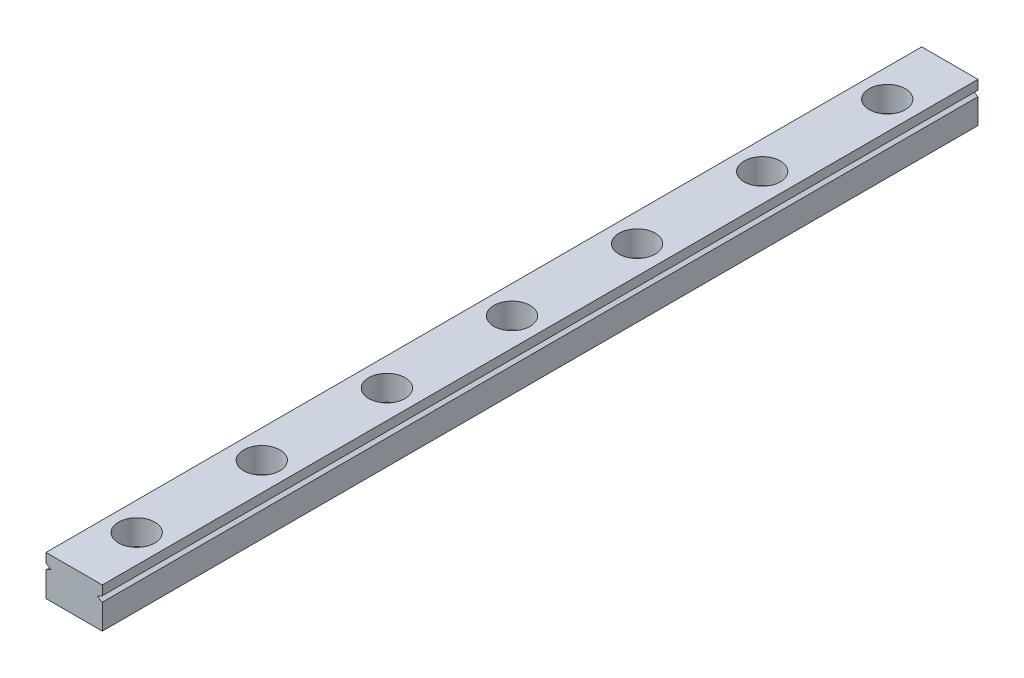
ISO-10303-21;
HEADER;
FILE_DESCRIPTION(('STEP AP214'),'2;1');
FILE_NAME('part.step','',(''),(''),'','','');
FILE_SCHEMA(('AUTOMOTIVE_DESIGN { 1 0 10303 214 1 1 1 1 }'));
ENDSEC;
DATA;
#1=APPLICATION_CONTEXT('core data for automotive mechanical design processes');
#2=APPLICATION_PROTOCOL_DEFINITION('international standard','automotive_design',2000,#1);
#3=PRODUCT_CONTEXT('',#1,'mechanical');
#4=PRODUCT('Part','Part','',(#3));
#5=PRODUCT_RELATED_PRODUCT_CATEGORY('part','',(#4));
#6=PRODUCT_DEFINITION_FORMATION('','',#4);
#7=PRODUCT_DEFINITION_CONTEXT('part definition',#1,'design');
#8=PRODUCT_DEFINITION('design','',#6,#7);
#9=PRODUCT_DEFINITION_SHAPE('','',#8);
#10=(LENGTH_UNIT() NAMED_UNIT(*) SI_UNIT(.MILLI.,.METRE.));
#11=(NAMED_UNIT(*) PLANE_ANGLE_UNIT() SI_UNIT($,.RADIAN.));
#12=(NAMED_UNIT(*) SI_UNIT($,.STERADIAN.) SOLID_ANGLE_UNIT());
#13=UNCERTAINTY_MEASURE_WITH_UNIT(LENGTH_MEASURE(1.E-05),#10,'distance_accuracy_value','');
#14=(GEOMETRIC_REPRESENTATION_CONTEXT(3) GLOBAL_UNCERTAINTY_ASSIGNED_CONTEXT((#13)) GLOBAL_UNIT_ASSIGNED_CONTEXT((#10,
#11,#12)) REPRESENTATION_CONTEXT('',''));
#15=CARTESIAN_POINT('',(0.,0.,0.));
#16=DIRECTION('',(0.,0.,1.));
#17=DIRECTION('',(1.,0.,0.));
#18=AXIS2_PLACEMENT_3D('',#15,#16,#17);
#19=CARTESIAN_POINT('',(0.,4.,140.));
#20=DIRECTION('',(1.,0.,0.));
#21=DIRECTION('',(0.,0.,-1.));
#22=AXIS2_PLACEMENT_3D('',#19,#20,#21);
#23=PLANE('',#22);
#24=DIRECTION('',(0.,-1.,0.));
#25=VECTOR('',#24,1.);
#26=CARTESIAN_POINT('',(0.,4.,0.));
#27=LINE('',#26,#25);
#28=CARTESIAN_POINT('',(0.,4.,0.));
#29=VERTEX_POINT('',#28);
#30=CARTESIAN_POINT('',(0.,0.,0.));
#31=VERTEX_POINT('',#30);
#32=EDGE_CURVE('E141',#29,#31,#27,.T.);
#33=ORIENTED_EDGE('',*,*,#32,.T.);
#34=DIRECTION('',(0.,0.,-1.));
#35=VECTOR('',#34,1.);
#36=CARTESIAN_POINT('',(0.,0.,140.));
#37=LINE('',#36,#35);
#38=CARTESIAN_POINT('',(0.,0.,140.));
#39=VERTEX_POINT('',#38);
#40=EDGE_CURVE('E11',#39,#31,#37,.T.);
#41=ORIENTED_EDGE('',*,*,#40,.F.);
#42=DIRECTION('',(0.,-1.,0.));
#43=VECTOR('',#42,1.);
#44=CARTESIAN_POINT('',(0.,4.,140.));
#45=LINE('',#44,#43);
#46=CARTESIAN_POINT('',(0.,4.,140.));
#47=VERTEX_POINT('',#46);
#48=EDGE_CURVE('E160',#47,#39,#45,.T.);
#49=ORIENTED_EDGE('',*,*,#48,.F.);
#50=DIRECTION('',(0.,0.,-1.));
#51=VECTOR('',#50,1.);
#52=CARTESIAN_POINT('',(0.,4.,140.));
#53=LINE('',#52,#51);
#54=EDGE_CURVE('E137',#47,#29,#53,.T.);
#55=ORIENTED_EDGE('',*,*,#54,.T.);
#56=EDGE_LOOP('',(#33,#41,#49,#55));
#57=FACE_BOUND('',#56,.T.);
#58=ADVANCED_FACE('F33',(#57),#23,.F.);
#59=CARTESIAN_POINT('',(0.,0.,140.));
#60=DIRECTION('',(0.,1.,0.));
#61=DIRECTION('',(0.,0.,1.));
#62=AXIS2_PLACEMENT_3D('',#59,#60,#61);
#63=PLANE('',#62);
#64=CARTESIAN_POINT('',(4.5,0.,130.));
#65=DIRECTION('',(0.,1.,0.));
#66=DIRECTION('',(0.,0.,1.));
#67=AXIS2_PLACEMENT_3D('',#64,#65,#66);
#68=CIRCLE('',#67,1.7);
#69=CARTESIAN_POINT('',(4.5,0.,131.7));
#70=VERTEX_POINT('',#69);
#71=EDGE_CURVE('E211',#70,#70,#68,.T.);
#72=ORIENTED_EDGE('',*,*,#71,.T.);
#73=EDGE_LOOP('',(#72));
#74=FACE_BOUND('',#73,.T.);
#75=CARTESIAN_POINT('',(4.49999999999993,0.,110.));
#76=DIRECTION('',(0.,1.,0.));
#77=DIRECTION('',(0.,0.,1.));
#78=AXIS2_PLACEMENT_3D('',#75,#76,#77);
#79=CIRCLE('',#78,1.7);
#80=CARTESIAN_POINT('',(4.49999999999993,0.,111.7));
#81=VERTEX_POINT('',#80);
#82=EDGE_CURVE('E282',#81,#81,#79,.T.);
#83=ORIENTED_EDGE('',*,*,#82,.T.);
#84=EDGE_LOOP('',(#83));
#85=FACE_BOUND('',#84,.T.);
#86=CARTESIAN_POINT('',(4.49999999999986,0.,90.));
#87=DIRECTION('',(0.,1.,0.));
#88=DIRECTION('',(0.,0.,1.));
#89=AXIS2_PLACEMENT_3D('',#86,#87,#88);
#90=CIRCLE('',#89,1.7);
#91=CARTESIAN_POINT('',(4.49999999999986,0.,91.7));
#92=VERTEX_POINT('',#91);
#93=EDGE_CURVE('E276',#92,#92,#90,.T.);
#94=ORIENTED_EDGE('',*,*,#93,.T.);
#95=EDGE_LOOP('',(#94));
#96=FACE_BOUND('',#95,.T.);
#97=CARTESIAN_POINT('',(4.49999999999979,0.,70.));
#98=DIRECTION('',(0.,1.,0.));
#99=DIRECTION('',(0.,0.,1.));
#100=AXIS2_PLACEMENT_3D('',#97,#98,#99);
#101=CIRCLE('',#100,1.7);
#102=CARTESIAN_POINT('',(4.49999999999979,0.,71.7));
#103=VERTEX_POINT('',#102);
#104=EDGE_CURVE('E270',#103,#103,#101,.T.);
#105=ORIENTED_EDGE('',*,*,#104,.T.);
#106=EDGE_LOOP('',(#105));
#107=FACE_BOUND('',#106,.T.);
#108=CARTESIAN_POINT('',(4.49999999999972,0.,50.));
#109=DIRECTION('',(0.,1.,0.));
#110=DIRECTION('',(0.,0.,1.));
#111=AXIS2_PLACEMENT_3D('',#108,#109,#110);
#112=CIRCLE('',#111,1.7);
#113=CARTESIAN_POINT('',(4.49999999999972,0.,51.7));
#114=VERTEX_POINT('',#113);
#115=EDGE_CURVE('E264',#114,#114,#112,.T.);
#116=ORIENTED_EDGE('',*,*,#115,.T.);
#117=EDGE_LOOP('',(#116));
#118=FACE_BOUND('',#117,.T.);
#119=CARTESIAN_POINT('',(4.49999999999965,0.,30.));
#120=DIRECTION('',(0.,1.,0.));
#121=DIRECTION('',(0.,0.,1.));
#122=AXIS2_PLACEMENT_3D('',#119,#120,#121);
#123=CIRCLE('',#122,1.7);
#124=CARTESIAN_POINT('',(4.49999999999965,0.,31.7));
#125=VERTEX_POINT('',#124);
#126=EDGE_CURVE('E258',#125,#125,#123,.T.);
#127=ORIENTED_EDGE('',*,*,#126,.T.);
#128=EDGE_LOOP('',(#127));
#129=FACE_BOUND('',#128,.T.);
#130=CARTESIAN_POINT('',(4.49999999999958,0.,10.));
#131=DIRECTION('',(0.,1.,0.));
#132=DIRECTION('',(0.,0.,1.));
#133=AXIS2_PLACEMENT_3D('',#130,#131,#132);
#134=CIRCLE('',#133,1.7);
#135=CARTESIAN_POINT('',(4.49999999999958,0.,11.7));
#136=VERTEX_POINT('',#135);
#137=EDGE_CURVE('E252',#136,#136,#134,.T.);
#138=ORIENTED_EDGE('',*,*,#137,.T.);
#139=EDGE_LOOP('',(#138));
#140=FACE_BOUND('',#139,.T.);
#141=DIRECTION('',(1.,0.,0.));
#142=VECTOR('',#141,1.);
#143=CARTESIAN_POINT('',(0.,0.,0.));
#144=LINE('',#143,#142);
#145=CARTESIAN_POINT('',(9.,0.,0.));
#146=VERTEX_POINT('',#145);
#147=EDGE_CURVE('E144',#31,#146,#144,.T.);
#148=ORIENTED_EDGE('',*,*,#147,.T.);
#149=DIRECTION('',(0.,0.,-1.));
#150=VECTOR('',#149,1.);
#151=CARTESIAN_POINT('',(9.,0.,140.));
#152=LINE('',#151,#150);
#153=CARTESIAN_POINT('',(9.,0.,140.));
#154=VERTEX_POINT('',#153);
#155=EDGE_CURVE('E41',#154,#146,#152,.T.);
#156=ORIENTED_EDGE('',*,*,#155,.F.);
#157=DIRECTION('',(1.,0.,0.));
#158=VECTOR('',#157,1.);
#159=CARTESIAN_POINT('',(0.,0.,140.));
#160=LINE('',#159,#158);
#161=EDGE_CURVE('E98',#39,#154,#160,.T.);
#162=ORIENTED_EDGE('',*,*,#161,.F.);
#163=ORIENTED_EDGE('',*,*,#40,.T.);
#164=EDGE_LOOP('',(#148,#156,#162,#163));
#165=FACE_BOUND('',#164,.T.);
#166=ADVANCED_FACE('F291',(#74,#85,#96,#107,#118,#129,#140,#165),#63,.F.);
#167=CARTESIAN_POINT('',(9.,4.,140.));
#168=DIRECTION('',(-1.,0.,0.));
#169=DIRECTION('',(0.,-1.,0.));
#170=AXIS2_PLACEMENT_3D('',#167,#168,#169);
#171=PLANE('',#170);
#172=DIRECTION('',(0.,1.,0.));
#173=VECTOR('',#172,1.);
#174=CARTESIAN_POINT('',(9.,4.,0.));
#175=LINE('',#174,#173);
#176=CARTESIAN_POINT('',(9.,4.,0.));
#177=VERTEX_POINT('',#176);
#178=EDGE_CURVE('E147',#146,#177,#175,.T.);
#179=ORIENTED_EDGE('',*,*,#178,.T.);
#180=DIRECTION('',(0.,0.,-1.));
#181=VECTOR('',#180,1.);
#182=CARTESIAN_POINT('',(9.,4.,140.));
#183=LINE('',#182,#181);
#184=CARTESIAN_POINT('',(9.,4.,140.));
#185=VERTEX_POINT('',#184);
#186=EDGE_CURVE('E173',#185,#177,#183,.T.);
#187=ORIENTED_EDGE('',*,*,#186,.F.);
#188=DIRECTION('',(0.,1.,0.));
#189=VECTOR('',#188,1.);
#190=CARTESIAN_POINT('',(9.,4.,140.));
#191=LINE('',#190,#189);
#192=EDGE_CURVE('E181',#154,#185,#191,.T.);
#193=ORIENTED_EDGE('',*,*,#192,.F.);
#194=ORIENTED_EDGE('',*,*,#155,.T.);
#195=EDGE_LOOP('',(#179,#187,#193,#194));
#196=FACE_BOUND('',#195,.T.);
#197=ADVANCED_FACE('F179',(#196),#171,.F.);
#198=CARTESIAN_POINT('',(8.2,4.45,140.));
#199=DIRECTION('',(-0.490261239632559,-0.871575537124549,0.));
#200=DIRECTION('',(0.871575537124549,-0.490261239632559,0.));
#201=AXIS2_PLACEMENT_3D('',#198,#199,#200);
#202=PLANE('',#201);
#203=DIRECTION('',(-0.871575537124549,0.490261239632559,0.));
#204=VECTOR('',#203,1.);
#205=CARTESIAN_POINT('',(8.2,4.45,0.));
#206=LINE('',#205,#204);
#207=CARTESIAN_POINT('',(8.2,4.45,0.));
#208=VERTEX_POINT('',#207);
#209=EDGE_CURVE('E149',#177,#208,#206,.T.);
#210=ORIENTED_EDGE('',*,*,#209,.T.);
#211=DIRECTION('',(0.,0.,-1.));
#212=VECTOR('',#211,1.);
#213=CARTESIAN_POINT('',(8.2,4.45,140.));
#214=LINE('',#213,#212);
#215=CARTESIAN_POINT('',(8.2,4.45,140.));
#216=VERTEX_POINT('',#215);
#217=EDGE_CURVE('E170',#216,#208,#214,.T.);
#218=ORIENTED_EDGE('',*,*,#217,.F.);
#219=DIRECTION('',(-0.871575537124549,0.490261239632559,0.));
#220=VECTOR('',#219,1.);
#221=CARTESIAN_POINT('',(8.2,4.45,140.));
#222=LINE('',#221,#220);
#223=EDGE_CURVE('E199',#185,#216,#222,.T.);
#224=ORIENTED_EDGE('',*,*,#223,.F.);
#225=ORIENTED_EDGE('',*,*,#186,.T.);
#226=EDGE_LOOP('',(#210,#218,#224,#225));
#227=FACE_BOUND('',#226,.T.);
#228=ADVANCED_FACE('F190',(#227),#202,.F.);
#229=CARTESIAN_POINT('',(9.,4.9,140.));
#230=DIRECTION('',(-0.490261239632559,0.871575537124549,0.));
#231=DIRECTION('',(-0.871575537124549,-0.490261239632559,0.));
#232=AXIS2_PLACEMENT_3D('',#229,#230,#231);
#233=PLANE('',#232);
#234=DIRECTION('',(0.871575537124549,0.490261239632559,0.));
#235=VECTOR('',#234,1.);
#236=CARTESIAN_POINT('',(9.,4.9,0.));
#237=LINE('',#236,#235);
#238=CARTESIAN_POINT('',(9.,4.9,0.));
#239=VERTEX_POINT('',#238);
#240=EDGE_CURVE('E151',#208,#239,#237,.T.);
#241=ORIENTED_EDGE('',*,*,#240,.T.);
#242=DIRECTION('',(0.,0.,-1.));
#243=VECTOR('',#242,1.);
#244=CARTESIAN_POINT('',(9.,4.9,140.));
#245=LINE('',#244,#243);
#246=CARTESIAN_POINT('',(9.,4.9,140.));
#247=VERTEX_POINT('',#246);
#248=EDGE_CURVE('E167',#247,#239,#245,.T.);
#249=ORIENTED_EDGE('',*,*,#248,.F.);
#250=DIRECTION('',(0.871575537124549,0.490261239632559,0.));
#251=VECTOR('',#250,1.);
#252=CARTESIAN_POINT('',(9.,4.9,140.));
#253=LINE('',#252,#251);
#254=EDGE_CURVE('E196',#216,#247,#253,.T.);
#255=ORIENTED_EDGE('',*,*,#254,.F.);
#256=ORIENTED_EDGE('',*,*,#217,.T.);
#257=EDGE_LOOP('',(#241,#249,#255,#256));
#258=FACE_BOUND('',#257,.T.);
#259=ADVANCED_FACE('F194',(#258),#233,.F.);
#260=CARTESIAN_POINT('',(9.,6.4,140.));
#261=DIRECTION('',(-1.,0.,0.));
#262=DIRECTION('',(0.,0.,1.));
#263=AXIS2_PLACEMENT_3D('',#260,#261,#262);
#264=PLANE('',#263);
#265=DIRECTION('',(0.,1.,0.));
#266=VECTOR('',#265,1.);
#267=CARTESIAN_POINT('',(9.,6.4,0.));
#268=LINE('',#267,#266);
#269=CARTESIAN_POINT('',(9.,6.4,0.));
#270=VERTEX_POINT('',#269);
#271=EDGE_CURVE('E153',#239,#270,#268,.T.);
#272=ORIENTED_EDGE('',*,*,#271,.T.);
#273=DIRECTION('',(0.,0.,-1.));
#274=VECTOR('',#273,1.);
#275=CARTESIAN_POINT('',(9.,6.4,140.));
#276=LINE('',#275,#274);
#277=CARTESIAN_POINT('',(9.,6.4,140.));
#278=VERTEX_POINT('',#277);
#279=EDGE_CURVE('E164',#278,#270,#276,.T.);
#280=ORIENTED_EDGE('',*,*,#279,.F.);
#281=DIRECTION('',(0.,1.,0.));
#282=VECTOR('',#281,1.);
#283=CARTESIAN_POINT('',(9.,6.4,140.));
#284=LINE('',#283,#282);
#285=EDGE_CURVE('E198',#247,#278,#284,.T.);
#286=ORIENTED_EDGE('',*,*,#285,.F.);
#287=ORIENTED_EDGE('',*,*,#248,.T.);
#288=EDGE_LOOP('',(#272,#280,#286,#287));
#289=FACE_BOUND('',#288,.T.);
#290=ADVANCED_FACE('F318',(#289),#264,.F.);
#291=CARTESIAN_POINT('',(0.,6.4,140.));
#292=DIRECTION('',(0.,-1.,0.));
#293=DIRECTION('',(0.,0.,-1.));
#294=AXIS2_PLACEMENT_3D('',#291,#292,#293);
#295=PLANE('',#294);
#296=CARTESIAN_POINT('',(4.5,6.4,130.));
#297=DIRECTION('',(0.,1.,0.));
#298=DIRECTION('',(0.,0.,1.));
#299=AXIS2_PLACEMENT_3D('',#296,#297,#298);
#300=CIRCLE('',#299,2.9);
#301=CARTESIAN_POINT('',(4.5,6.4,132.9));
#302=VERTEX_POINT('',#301);
#303=EDGE_CURVE('E244',#302,#302,#300,.T.);
#304=ORIENTED_EDGE('',*,*,#303,.F.);
#305=EDGE_LOOP('',(#304));
#306=FACE_BOUND('',#305,.T.);
#307=CARTESIAN_POINT('',(4.49999999999993,6.4,110.));
#308=DIRECTION('',(0.,1.,0.));
#309=DIRECTION('',(0.,0.,1.));
#310=AXIS2_PLACEMENT_3D('',#307,#308,#309);
#311=CIRCLE('',#310,2.9);
#312=CARTESIAN_POINT('',(4.49999999999993,6.4,112.9));
#313=VERTEX_POINT('',#312);
#314=EDGE_CURVE('E238',#313,#313,#311,.T.);
#315=ORIENTED_EDGE('',*,*,#314,.F.);
#316=EDGE_LOOP('',(#315));
#317=FACE_BOUND('',#316,.T.);
#318=CARTESIAN_POINT('',(4.49999999999986,6.4,90.));
#319=DIRECTION('',(0.,1.,0.));
#320=DIRECTION('',(0.,0.,1.));
#321=AXIS2_PLACEMENT_3D('',#318,#319,#320);
#322=CIRCLE('',#321,2.9);
#323=CARTESIAN_POINT('',(4.49999999999986,6.4,92.9));
#324=VERTEX_POINT('',#323);
#325=EDGE_CURVE('E232',#324,#324,#322,.T.);
#326=ORIENTED_EDGE('',*,*,#325,.F.);
#327=EDGE_LOOP('',(#326));
#328=FACE_BOUND('',#327,.T.);
#329=CARTESIAN_POINT('',(4.49999999999979,6.4,70.));
#330=DIRECTION('',(0.,1.,0.));
#331=DIRECTION('',(0.,0.,1.));
#332=AXIS2_PLACEMENT_3D('',#329,#330,#331);
#333=CIRCLE('',#332,2.9);
#334=CARTESIAN_POINT('',(4.49999999999979,6.4,72.9));
#335=VERTEX_POINT('',#334);
#336=EDGE_CURVE('E226',#335,#335,#333,.T.);
#337=ORIENTED_EDGE('',*,*,#336,.F.);
#338=EDGE_LOOP('',(#337));
#339=FACE_BOUND('',#338,.T.);
#340=CARTESIAN_POINT('',(4.49999999999972,6.4,50.));
#341=DIRECTION('',(0.,1.,0.));
#342=DIRECTION('',(0.,0.,1.));
#343=AXIS2_PLACEMENT_3D('',#340,#341,#342);
#344=CIRCLE('',#343,2.9);
#345=CARTESIAN_POINT('',(4.49999999999972,6.4,52.9));
#346=VERTEX_POINT('',#345);
#347=EDGE_CURVE('E220',#346,#346,#344,.T.);
#348=ORIENTED_EDGE('',*,*,#347,.F.);
#349=EDGE_LOOP('',(#348));
#350=FACE_BOUND('',#349,.T.);
#351=CARTESIAN_POINT('',(4.49999999999965,6.4,30.));
#352=DIRECTION('',(0.,1.,0.));
#353=DIRECTION('',(0.,0.,1.));
#354=AXIS2_PLACEMENT_3D('',#351,#352,#353);
#355=CIRCLE('',#354,2.9);
#356=CARTESIAN_POINT('',(4.49999999999965,6.4,32.9));
#357=VERTEX_POINT('',#356);
#358=EDGE_CURVE('E214',#357,#357,#355,.T.);
#359=ORIENTED_EDGE('',*,*,#358,.F.);
#360=EDGE_LOOP('',(#359));
#361=FACE_BOUND('',#360,.T.);
#362=CARTESIAN_POINT('',(4.49999999999958,6.4,10.));
#363=DIRECTION('',(0.,1.,0.));
#364=DIRECTION('',(0.,0.,1.));
#365=AXIS2_PLACEMENT_3D('',#362,#363,#364);
#366=CIRCLE('',#365,2.9);
#367=CARTESIAN_POINT('',(4.49999999999958,6.4,12.9));
#368=VERTEX_POINT('',#367);
#369=EDGE_CURVE('E207',#368,#368,#366,.T.);
#370=ORIENTED_EDGE('',*,*,#369,.F.);
#371=EDGE_LOOP('',(#370));
#372=FACE_BOUND('',#371,.T.);
#373=DIRECTION('',(-1.,0.,0.));
#374=VECTOR('',#373,1.);
#375=CARTESIAN_POINT('',(0.,6.4,0.));
#376=LINE('',#375,#374);
#377=CARTESIAN_POINT('',(0.,6.4,0.));
#378=VERTEX_POINT('',#377);
#379=EDGE_CURVE('E155',#270,#378,#376,.T.);
#380=ORIENTED_EDGE('',*,*,#379,.T.);
#381=DIRECTION('',(0.,0.,-1.));
#382=VECTOR('',#381,1.);
#383=CARTESIAN_POINT('',(0.,6.4,140.));
#384=LINE('',#383,#382);
#385=CARTESIAN_POINT('',(0.,6.4,140.));
#386=VERTEX_POINT('',#385);
#387=EDGE_CURVE('E132',#386,#378,#384,.T.);
#388=ORIENTED_EDGE('',*,*,#387,.F.);
#389=DIRECTION('',(-1.,0.,0.));
#390=VECTOR('',#389,1.);
#391=CARTESIAN_POINT('',(0.,6.4,140.));
#392=LINE('',#391,#390);
#393=EDGE_CURVE('E123',#278,#386,#392,.T.);
#394=ORIENTED_EDGE('',*,*,#393,.F.);
#395=ORIENTED_EDGE('',*,*,#279,.T.);
#396=EDGE_LOOP('',(#380,#388,#394,#395));
#397=FACE_BOUND('',#396,.T.);
#398=ADVANCED_FACE('F315',(#306,#317,#328,#339,#350,#361,#372,#397),#295,.F.);
#399=CARTESIAN_POINT('',(0.,6.4,140.));
#400=DIRECTION('',(1.,0.,0.));
#401=DIRECTION('',(0.,1.,0.));
#402=AXIS2_PLACEMENT_3D('',#399,#400,#401);
#403=PLANE('',#402);
#404=DIRECTION('',(0.,-1.,0.));
#405=VECTOR('',#404,1.);
#406=CARTESIAN_POINT('',(0.,6.4,0.));
#407=LINE('',#406,#405);
#408=CARTESIAN_POINT('',(0.,4.9,0.));
#409=VERTEX_POINT('',#408);
#410=EDGE_CURVE('E131',#378,#409,#407,.T.);
#411=ORIENTED_EDGE('',*,*,#410,.T.);
#412=DIRECTION('',(0.,0.,-1.));
#413=VECTOR('',#412,1.);
#414=CARTESIAN_POINT('',(0.,4.9,140.));
#415=LINE('',#414,#413);
#416=CARTESIAN_POINT('',(0.,4.9,140.));
#417=VERTEX_POINT('',#416);
#418=EDGE_CURVE('E128',#417,#409,#415,.T.);
#419=ORIENTED_EDGE('',*,*,#418,.F.);
#420=DIRECTION('',(0.,-1.,0.));
#421=VECTOR('',#420,1.);
#422=CARTESIAN_POINT('',(0.,6.4,140.));
#423=LINE('',#422,#421);
#424=EDGE_CURVE('E117',#386,#417,#423,.T.);
#425=ORIENTED_EDGE('',*,*,#424,.F.);
#426=ORIENTED_EDGE('',*,*,#387,.T.);
#427=EDGE_LOOP('',(#411,#419,#425,#426));
#428=FACE_BOUND('',#427,.T.);
#429=ADVANCED_FACE('F129',(#428),#403,.F.);
#430=CARTESIAN_POINT('',(0.,4.9,140.));
#431=DIRECTION('',(0.490261239632558,0.87157553712455,0.));
#432=DIRECTION('',(-0.87157553712455,0.490261239632558,0.));
#433=AXIS2_PLACEMENT_3D('',#430,#431,#432);
#434=PLANE('',#433);
#435=DIRECTION('',(0.87157553712455,-0.490261239632558,0.));
#436=VECTOR('',#435,1.);
#437=CARTESIAN_POINT('',(0.,4.9,0.));
#438=LINE('',#437,#436);
#439=CARTESIAN_POINT('',(0.800000000000001,4.45,0.));
#440=VERTEX_POINT('',#439);
#441=EDGE_CURVE('E84',#409,#440,#438,.T.);
#442=ORIENTED_EDGE('',*,*,#441,.T.);
#443=DIRECTION('',(0.,0.,-1.));
#444=VECTOR('',#443,1.);
#445=CARTESIAN_POINT('',(0.800000000000001,4.45,140.));
#446=LINE('',#445,#444);
#447=CARTESIAN_POINT('',(0.800000000000001,4.45,140.));
#448=VERTEX_POINT('',#447);
#449=EDGE_CURVE('E133',#448,#440,#446,.T.);
#450=ORIENTED_EDGE('',*,*,#449,.F.);
#451=DIRECTION('',(0.87157553712455,-0.490261239632558,0.));
#452=VECTOR('',#451,1.);
#453=CARTESIAN_POINT('',(0.,4.9,140.));
#454=LINE('',#453,#452);
#455=EDGE_CURVE('E121',#417,#448,#454,.T.);
#456=ORIENTED_EDGE('',*,*,#455,.F.);
#457=ORIENTED_EDGE('',*,*,#418,.T.);
#458=EDGE_LOOP('',(#442,#450,#456,#457));
#459=FACE_BOUND('',#458,.T.);
#460=ADVANCED_FACE('F135',(#459),#434,.F.);
#461=CARTESIAN_POINT('',(0.800000000000001,4.45,140.));
#462=DIRECTION('',(0.490261239632558,-0.87157553712455,0.));
#463=DIRECTION('',(0.87157553712455,0.490261239632558,0.));
#464=AXIS2_PLACEMENT_3D('',#461,#462,#463);
#465=PLANE('',#464);
#466=DIRECTION('',(-0.87157553712455,-0.490261239632558,0.));
#467=VECTOR('',#466,1.);
#468=CARTESIAN_POINT('',(0.800000000000001,4.45,0.));
#469=LINE('',#468,#467);
#470=EDGE_CURVE('E90',#440,#29,#469,.T.);
#471=ORIENTED_EDGE('',*,*,#470,.T.);
#472=ORIENTED_EDGE('',*,*,#54,.F.);
#473=DIRECTION('',(-0.87157553712455,-0.490261239632558,0.));
#474=VECTOR('',#473,1.);
#475=CARTESIAN_POINT('',(0.800000000000001,4.45,140.));
#476=LINE('',#475,#474);
#477=EDGE_CURVE('E49',#448,#47,#476,.T.);
#478=ORIENTED_EDGE('',*,*,#477,.F.);
#479=ORIENTED_EDGE('',*,*,#449,.T.);
#480=EDGE_LOOP('',(#471,#472,#478,#479));
#481=FACE_BOUND('',#480,.T.);
#482=ADVANCED_FACE('F337',(#481),#465,.F.);
#483=CARTESIAN_POINT('',(0.,0.,140.));
#484=DIRECTION('',(0.,0.,1.));
#485=DIRECTION('',(1.,0.,0.));
#486=AXIS2_PLACEMENT_3D('',#483,#484,#485);
#487=PLANE('',#486);
#488=ORIENTED_EDGE('',*,*,#48,.T.);
#489=ORIENTED_EDGE('',*,*,#161,.T.);
#490=ORIENTED_EDGE('',*,*,#192,.T.);
#491=ORIENTED_EDGE('',*,*,#223,.T.);
#492=ORIENTED_EDGE('',*,*,#254,.T.);
#493=ORIENTED_EDGE('',*,*,#285,.T.);
#494=ORIENTED_EDGE('',*,*,#393,.T.);
#495=ORIENTED_EDGE('',*,*,#424,.T.);
#496=ORIENTED_EDGE('',*,*,#455,.T.);
#497=ORIENTED_EDGE('',*,*,#477,.T.);
#498=EDGE_LOOP('',(#488,#489,#490,#491,#492,#493,#494,#495,#496,#497));
#499=FACE_BOUND('',#498,.T.);
#500=ADVANCED_FACE('F119',(#499),#487,.T.);
#501=CARTESIAN_POINT('',(0.,0.,0.));
#502=DIRECTION('',(0.,0.,1.));
#503=DIRECTION('',(1.,0.,0.));
#504=AXIS2_PLACEMENT_3D('',#501,#502,#503);
#505=PLANE('',#504);
#506=ORIENTED_EDGE('',*,*,#32,.F.);
#507=ORIENTED_EDGE('',*,*,#470,.F.);
#508=ORIENTED_EDGE('',*,*,#441,.F.);
#509=ORIENTED_EDGE('',*,*,#410,.F.);
#510=ORIENTED_EDGE('',*,*,#379,.F.);
#511=ORIENTED_EDGE('',*,*,#271,.F.);
#512=ORIENTED_EDGE('',*,*,#240,.F.);
#513=ORIENTED_EDGE('',*,*,#209,.F.);
#514=ORIENTED_EDGE('',*,*,#178,.F.);
#515=ORIENTED_EDGE('',*,*,#147,.F.);
#516=EDGE_LOOP('',(#506,#507,#508,#509,#510,#511,#512,#513,#514,#515));
#517=FACE_BOUND('',#516,.T.);
#518=ADVANCED_FACE('F185',(#517),#505,.F.);
#519=CARTESIAN_POINT('',(4.49999999999958,2.4,10.));
#520=DIRECTION('',(0.,1.,0.));
#521=DIRECTION('',(0.,0.,1.));
#522=AXIS2_PLACEMENT_3D('',#519,#520,#521);
#523=CYLINDRICAL_SURFACE('',#522,2.9);
#524=CARTESIAN_POINT('',(4.49999999999958,2.4,10.));
#525=DIRECTION('',(0.,1.,0.));
#526=DIRECTION('',(0.,0.,1.));
#527=AXIS2_PLACEMENT_3D('',#524,#525,#526);
#528=CIRCLE('',#527,2.9);
#529=CARTESIAN_POINT('',(4.49999999999958,2.4,12.9));
#530=VERTEX_POINT('',#529);
#531=EDGE_CURVE('E210',#530,#530,#528,.T.);
#532=ORIENTED_EDGE('',*,*,#531,.F.);
#533=EDGE_LOOP('',(#532));
#534=FACE_BOUND('',#533,.T.);
#535=ORIENTED_EDGE('',*,*,#369,.T.);
#536=EDGE_LOOP('',(#535));
#537=FACE_BOUND('',#536,.T.);
#538=ADVANCED_FACE('F391',(#534,#537),#523,.F.);
#539=CARTESIAN_POINT('',(4.49999999999958,2.4,10.));
#540=DIRECTION('',(0.,1.,0.));
#541=DIRECTION('',(0.,0.,1.));
#542=AXIS2_PLACEMENT_3D('',#539,#540,#541);
#543=PLANE('',#542);
#544=CARTESIAN_POINT('',(4.49999999999958,2.4,10.));
#545=DIRECTION('',(0.,1.,0.));
#546=DIRECTION('',(0.,0.,1.));
#547=AXIS2_PLACEMENT_3D('',#544,#545,#546);
#548=CIRCLE('',#547,1.7);
#549=CARTESIAN_POINT('',(4.49999999999958,2.4,11.7));
#550=VERTEX_POINT('',#549);
#551=EDGE_CURVE('E249',#550,#550,#548,.T.);
#552=ORIENTED_EDGE('',*,*,#551,.F.);
#553=EDGE_LOOP('',(#552));
#554=FACE_BOUND('',#553,.T.);
#555=ORIENTED_EDGE('',*,*,#531,.T.);
#556=EDGE_LOOP('',(#555));
#557=FACE_BOUND('',#556,.T.);
#558=ADVANCED_FACE('F405',(#554,#557),#543,.T.);
#559=CARTESIAN_POINT('',(4.49999999999965,2.4,30.));
#560=DIRECTION('',(0.,1.,0.));
#561=DIRECTION('',(0.,0.,1.));
#562=AXIS2_PLACEMENT_3D('',#559,#560,#561);
#563=CYLINDRICAL_SURFACE('',#562,2.9);
#564=CARTESIAN_POINT('',(4.49999999999965,2.4,30.));
#565=DIRECTION('',(0.,1.,0.));
#566=DIRECTION('',(0.,0.,1.));
#567=AXIS2_PLACEMENT_3D('',#564,#565,#566);
#568=CIRCLE('',#567,2.9);
#569=CARTESIAN_POINT('',(4.49999999999965,2.4,32.9));
#570=VERTEX_POINT('',#569);
#571=EDGE_CURVE('E217',#570,#570,#568,.T.);
#572=ORIENTED_EDGE('',*,*,#571,.F.);
#573=EDGE_LOOP('',(#572));
#574=FACE_BOUND('',#573,.T.);
#575=ORIENTED_EDGE('',*,*,#358,.T.);
#576=EDGE_LOOP('',(#575));
#577=FACE_BOUND('',#576,.T.);
#578=ADVANCED_FACE('F413',(#574,#577),#563,.F.);
#579=CARTESIAN_POINT('',(4.49999999999965,2.4,30.));
#580=DIRECTION('',(0.,1.,0.));
#581=DIRECTION('',(0.,0.,1.));
#582=AXIS2_PLACEMENT_3D('',#579,#580,#581);
#583=PLANE('',#582);
#584=CARTESIAN_POINT('',(4.49999999999965,2.4,30.));
#585=DIRECTION('',(0.,1.,0.));
#586=DIRECTION('',(0.,0.,1.));
#587=AXIS2_PLACEMENT_3D('',#584,#585,#586);
#588=CIRCLE('',#587,1.7);
#589=CARTESIAN_POINT('',(4.49999999999965,2.4,31.7));
#590=VERTEX_POINT('',#589);
#591=EDGE_CURVE('E255',#590,#590,#588,.T.);
#592=ORIENTED_EDGE('',*,*,#591,.F.);
#593=EDGE_LOOP('',(#592));
#594=FACE_BOUND('',#593,.T.);
#595=ORIENTED_EDGE('',*,*,#571,.T.);
#596=EDGE_LOOP('',(#595));
#597=FACE_BOUND('',#596,.T.);
#598=ADVANCED_FACE('F418',(#594,#597),#583,.T.);
#599=CARTESIAN_POINT('',(4.49999999999972,2.4,50.));
#600=DIRECTION('',(0.,1.,0.));
#601=DIRECTION('',(0.,0.,1.));
#602=AXIS2_PLACEMENT_3D('',#599,#600,#601);
#603=CYLINDRICAL_SURFACE('',#602,2.9);
#604=CARTESIAN_POINT('',(4.49999999999972,2.4,50.));
#605=DIRECTION('',(0.,1.,0.));
#606=DIRECTION('',(0.,0.,1.));
#607=AXIS2_PLACEMENT_3D('',#604,#605,#606);
#608=CIRCLE('',#607,2.9);
#609=CARTESIAN_POINT('',(4.49999999999972,2.4,52.9));
#610=VERTEX_POINT('',#609);
#611=EDGE_CURVE('E223',#610,#610,#608,.T.);
#612=ORIENTED_EDGE('',*,*,#611,.F.);
#613=EDGE_LOOP('',(#612));
#614=FACE_BOUND('',#613,.T.);
#615=ORIENTED_EDGE('',*,*,#347,.T.);
#616=EDGE_LOOP('',(#615));
#617=FACE_BOUND('',#616,.T.);
#618=ADVANCED_FACE('F426',(#614,#617),#603,.F.);
#619=CARTESIAN_POINT('',(4.49999999999972,2.4,50.));
#620=DIRECTION('',(0.,1.,0.));
#621=DIRECTION('',(0.,0.,1.));
#622=AXIS2_PLACEMENT_3D('',#619,#620,#621);
#623=PLANE('',#622);
#624=CARTESIAN_POINT('',(4.49999999999972,2.4,50.));
#625=DIRECTION('',(0.,1.,0.));
#626=DIRECTION('',(0.,0.,1.));
#627=AXIS2_PLACEMENT_3D('',#624,#625,#626);
#628=CIRCLE('',#627,1.7);
#629=CARTESIAN_POINT('',(4.49999999999972,2.4,51.7));
#630=VERTEX_POINT('',#629);
#631=EDGE_CURVE('E261',#630,#630,#628,.T.);
#632=ORIENTED_EDGE('',*,*,#631,.F.);
#633=EDGE_LOOP('',(#632));
#634=FACE_BOUND('',#633,.T.);
#635=ORIENTED_EDGE('',*,*,#611,.T.);
#636=EDGE_LOOP('',(#635));
#637=FACE_BOUND('',#636,.T.);
#638=ADVANCED_FACE('F431',(#634,#637),#623,.T.);
#639=CARTESIAN_POINT('',(4.49999999999979,2.4,70.));
#640=DIRECTION('',(0.,1.,0.));
#641=DIRECTION('',(0.,0.,1.));
#642=AXIS2_PLACEMENT_3D('',#639,#640,#641);
#643=CYLINDRICAL_SURFACE('',#642,2.9);
#644=CARTESIAN_POINT('',(4.49999999999979,2.4,70.));
#645=DIRECTION('',(0.,1.,0.));
#646=DIRECTION('',(0.,0.,1.));
#647=AXIS2_PLACEMENT_3D('',#644,#645,#646);
#648=CIRCLE('',#647,2.9);
#649=CARTESIAN_POINT('',(4.49999999999979,2.4,72.9));
#650=VERTEX_POINT('',#649);
#651=EDGE_CURVE('E229',#650,#650,#648,.T.);
#652=ORIENTED_EDGE('',*,*,#651,.F.);
#653=EDGE_LOOP('',(#652));
#654=FACE_BOUND('',#653,.T.);
#655=ORIENTED_EDGE('',*,*,#336,.T.);
#656=EDGE_LOOP('',(#655));
#657=FACE_BOUND('',#656,.T.);
#658=ADVANCED_FACE('F439',(#654,#657),#643,.F.);
#659=CARTESIAN_POINT('',(4.49999999999979,2.4,70.));
#660=DIRECTION('',(0.,1.,0.));
#661=DIRECTION('',(0.,0.,1.));
#662=AXIS2_PLACEMENT_3D('',#659,#660,#661);
#663=PLANE('',#662);
#664=CARTESIAN_POINT('',(4.49999999999979,2.4,70.));
#665=DIRECTION('',(0.,1.,0.));
#666=DIRECTION('',(0.,0.,1.));
#667=AXIS2_PLACEMENT_3D('',#664,#665,#666);
#668=CIRCLE('',#667,1.7);
#669=CARTESIAN_POINT('',(4.49999999999979,2.4,71.7));
#670=VERTEX_POINT('',#669);
#671=EDGE_CURVE('E267',#670,#670,#668,.T.);
#672=ORIENTED_EDGE('',*,*,#671,.F.);
#673=EDGE_LOOP('',(#672));
#674=FACE_BOUND('',#673,.T.);
#675=ORIENTED_EDGE('',*,*,#651,.T.);
#676=EDGE_LOOP('',(#675));
#677=FACE_BOUND('',#676,.T.);
#678=ADVANCED_FACE('F444',(#674,#677),#663,.T.);
#679=CARTESIAN_POINT('',(4.49999999999986,2.4,90.));
#680=DIRECTION('',(0.,1.,0.));
#681=DIRECTION('',(0.,0.,1.));
#682=AXIS2_PLACEMENT_3D('',#679,#680,#681);
#683=CYLINDRICAL_SURFACE('',#682,2.9);
#684=CARTESIAN_POINT('',(4.49999999999986,2.4,90.));
#685=DIRECTION('',(0.,1.,0.));
#686=DIRECTION('',(0.,0.,1.));
#687=AXIS2_PLACEMENT_3D('',#684,#685,#686);
#688=CIRCLE('',#687,2.9);
#689=CARTESIAN_POINT('',(4.49999999999986,2.4,92.9));
#690=VERTEX_POINT('',#689);
#691=EDGE_CURVE('E235',#690,#690,#688,.T.);
#692=ORIENTED_EDGE('',*,*,#691,.F.);
#693=EDGE_LOOP('',(#692));
#694=FACE_BOUND('',#693,.T.);
#695=ORIENTED_EDGE('',*,*,#325,.T.);
#696=EDGE_LOOP('',(#695));
#697=FACE_BOUND('',#696,.T.);
#698=ADVANCED_FACE('F452',(#694,#697),#683,.F.);
#699=CARTESIAN_POINT('',(4.49999999999986,2.4,90.));
#700=DIRECTION('',(0.,1.,0.));
#701=DIRECTION('',(0.,0.,1.));
#702=AXIS2_PLACEMENT_3D('',#699,#700,#701);
#703=PLANE('',#702);
#704=CARTESIAN_POINT('',(4.49999999999986,2.4,90.));
#705=DIRECTION('',(0.,1.,0.));
#706=DIRECTION('',(0.,0.,1.));
#707=AXIS2_PLACEMENT_3D('',#704,#705,#706);
#708=CIRCLE('',#707,1.7);
#709=CARTESIAN_POINT('',(4.49999999999986,2.4,91.7));
#710=VERTEX_POINT('',#709);
#711=EDGE_CURVE('E273',#710,#710,#708,.T.);
#712=ORIENTED_EDGE('',*,*,#711,.F.);
#713=EDGE_LOOP('',(#712));
#714=FACE_BOUND('',#713,.T.);
#715=ORIENTED_EDGE('',*,*,#691,.T.);
#716=EDGE_LOOP('',(#715));
#717=FACE_BOUND('',#716,.T.);
#718=ADVANCED_FACE('F457',(#714,#717),#703,.T.);
#719=CARTESIAN_POINT('',(4.49999999999993,2.4,110.));
#720=DIRECTION('',(0.,1.,0.));
#721=DIRECTION('',(0.,0.,1.));
#722=AXIS2_PLACEMENT_3D('',#719,#720,#721);
#723=CYLINDRICAL_SURFACE('',#722,2.9);
#724=CARTESIAN_POINT('',(4.49999999999993,2.4,110.));
#725=DIRECTION('',(0.,1.,0.));
#726=DIRECTION('',(0.,0.,1.));
#727=AXIS2_PLACEMENT_3D('',#724,#725,#726);
#728=CIRCLE('',#727,2.9);
#729=CARTESIAN_POINT('',(4.49999999999993,2.4,112.9));
#730=VERTEX_POINT('',#729);
#731=EDGE_CURVE('E241',#730,#730,#728,.T.);
#732=ORIENTED_EDGE('',*,*,#731,.F.);
#733=EDGE_LOOP('',(#732));
#734=FACE_BOUND('',#733,.T.);
#735=ORIENTED_EDGE('',*,*,#314,.T.);
#736=EDGE_LOOP('',(#735));
#737=FACE_BOUND('',#736,.T.);
#738=ADVANCED_FACE('F465',(#734,#737),#723,.F.);
#739=CARTESIAN_POINT('',(4.49999999999993,2.4,110.));
#740=DIRECTION('',(0.,1.,0.));
#741=DIRECTION('',(0.,0.,1.));
#742=AXIS2_PLACEMENT_3D('',#739,#740,#741);
#743=PLANE('',#742);
#744=CARTESIAN_POINT('',(4.49999999999993,2.4,110.));
#745=DIRECTION('',(0.,1.,0.));
#746=DIRECTION('',(0.,0.,1.));
#747=AXIS2_PLACEMENT_3D('',#744,#745,#746);
#748=CIRCLE('',#747,1.7);
#749=CARTESIAN_POINT('',(4.49999999999993,2.4,111.7));
#750=VERTEX_POINT('',#749);
#751=EDGE_CURVE('E279',#750,#750,#748,.T.);
#752=ORIENTED_EDGE('',*,*,#751,.F.);
#753=EDGE_LOOP('',(#752));
#754=FACE_BOUND('',#753,.T.);
#755=ORIENTED_EDGE('',*,*,#731,.T.);
#756=EDGE_LOOP('',(#755));
#757=FACE_BOUND('',#756,.T.);
#758=ADVANCED_FACE('F311',(#754,#757),#743,.T.);
#759=CARTESIAN_POINT('',(4.5,2.4,130.));
#760=DIRECTION('',(0.,1.,0.));
#761=DIRECTION('',(0.,0.,1.));
#762=AXIS2_PLACEMENT_3D('',#759,#760,#761);
#763=CYLINDRICAL_SURFACE('',#762,2.9);
#764=CARTESIAN_POINT('',(4.5,2.4,130.));
#765=DIRECTION('',(0.,1.,0.));
#766=DIRECTION('',(0.,0.,1.));
#767=AXIS2_PLACEMENT_3D('',#764,#765,#766);
#768=CIRCLE('',#767,2.9);
#769=CARTESIAN_POINT('',(4.5,2.4,132.9));
#770=VERTEX_POINT('',#769);
#771=EDGE_CURVE('E145',#770,#770,#768,.T.);
#772=ORIENTED_EDGE('',*,*,#771,.F.);
#773=EDGE_LOOP('',(#772));
#774=FACE_BOUND('',#773,.T.);
#775=ORIENTED_EDGE('',*,*,#303,.T.);
#776=EDGE_LOOP('',(#775));
#777=FACE_BOUND('',#776,.T.);
#778=ADVANCED_FACE('F305',(#774,#777),#763,.F.);
#779=CARTESIAN_POINT('',(4.5,2.4,130.));
#780=DIRECTION('',(0.,1.,0.));
#781=DIRECTION('',(0.,0.,1.));
#782=AXIS2_PLACEMENT_3D('',#779,#780,#781);
#783=PLANE('',#782);
#784=CARTESIAN_POINT('',(4.5,2.4,130.));
#785=DIRECTION('',(0.,1.,0.));
#786=DIRECTION('',(0.,0.,1.));
#787=AXIS2_PLACEMENT_3D('',#784,#785,#786);
#788=CIRCLE('',#787,1.7);
#789=CARTESIAN_POINT('',(4.5,2.4,131.7));
#790=VERTEX_POINT('',#789);
#791=EDGE_CURVE('E285',#790,#790,#788,.T.);
#792=ORIENTED_EDGE('',*,*,#791,.F.);
#793=EDGE_LOOP('',(#792));
#794=FACE_BOUND('',#793,.T.);
#795=ORIENTED_EDGE('',*,*,#771,.T.);
#796=EDGE_LOOP('',(#795));
#797=FACE_BOUND('',#796,.T.);
#798=ADVANCED_FACE('F301',(#794,#797),#783,.T.);
#799=CARTESIAN_POINT('',(4.49999999999958,0.,10.));
#800=DIRECTION('',(0.,1.,0.));
#801=DIRECTION('',(0.,0.,1.));
#802=AXIS2_PLACEMENT_3D('',#799,#800,#801);
#803=CYLINDRICAL_SURFACE('',#802,1.7);
#804=ORIENTED_EDGE('',*,*,#137,.F.);
#805=EDGE_LOOP('',(#804));
#806=FACE_BOUND('',#805,.T.);
#807=ORIENTED_EDGE('',*,*,#551,.T.);
#808=EDGE_LOOP('',(#807));
#809=FACE_BOUND('',#808,.T.);
#810=ADVANCED_FACE('F304',(#806,#809),#803,.F.);
#811=CARTESIAN_POINT('',(4.49999999999965,0.,30.));
#812=DIRECTION('',(0.,1.,0.));
#813=DIRECTION('',(0.,0.,1.));
#814=AXIS2_PLACEMENT_3D('',#811,#812,#813);
#815=CYLINDRICAL_SURFACE('',#814,1.7);
#816=ORIENTED_EDGE('',*,*,#126,.F.);
#817=EDGE_LOOP('',(#816));
#818=FACE_BOUND('',#817,.T.);
#819=ORIENTED_EDGE('',*,*,#591,.T.);
#820=EDGE_LOOP('',(#819));
#821=FACE_BOUND('',#820,.T.);
#822=ADVANCED_FACE('F541',(#818,#821),#815,.F.);
#823=CARTESIAN_POINT('',(4.49999999999972,0.,50.));
#824=DIRECTION('',(0.,1.,0.));
#825=DIRECTION('',(0.,0.,1.));
#826=AXIS2_PLACEMENT_3D('',#823,#824,#825);
#827=CYLINDRICAL_SURFACE('',#826,1.7);
#828=ORIENTED_EDGE('',*,*,#115,.F.);
#829=EDGE_LOOP('',(#828));
#830=FACE_BOUND('',#829,.T.);
#831=ORIENTED_EDGE('',*,*,#631,.T.);
#832=EDGE_LOOP('',(#831));
#833=FACE_BOUND('',#832,.T.);
#834=ADVANCED_FACE('F551',(#830,#833),#827,.F.);
#835=CARTESIAN_POINT('',(4.49999999999979,0.,70.));
#836=DIRECTION('',(0.,1.,0.));
#837=DIRECTION('',(0.,0.,1.));
#838=AXIS2_PLACEMENT_3D('',#835,#836,#837);
#839=CYLINDRICAL_SURFACE('',#838,1.7);
#840=ORIENTED_EDGE('',*,*,#104,.F.);
#841=EDGE_LOOP('',(#840));
#842=FACE_BOUND('',#841,.T.);
#843=ORIENTED_EDGE('',*,*,#671,.T.);
#844=EDGE_LOOP('',(#843));
#845=FACE_BOUND('',#844,.T.);
#846=ADVANCED_FACE('F561',(#842,#845),#839,.F.);
#847=CARTESIAN_POINT('',(4.49999999999986,0.,90.));
#848=DIRECTION('',(0.,1.,0.));
#849=DIRECTION('',(0.,0.,1.));
#850=AXIS2_PLACEMENT_3D('',#847,#848,#849);
#851=CYLINDRICAL_SURFACE('',#850,1.7);
#852=ORIENTED_EDGE('',*,*,#93,.F.);
#853=EDGE_LOOP('',(#852));
#854=FACE_BOUND('',#853,.T.);
#855=ORIENTED_EDGE('',*,*,#711,.T.);
#856=EDGE_LOOP('',(#855));
#857=FACE_BOUND('',#856,.T.);
#858=ADVANCED_FACE('F571',(#854,#857),#851,.F.);
#859=CARTESIAN_POINT('',(4.49999999999993,0.,110.));
#860=DIRECTION('',(0.,1.,0.));
#861=DIRECTION('',(0.,0.,1.));
#862=AXIS2_PLACEMENT_3D('',#859,#860,#861);
#863=CYLINDRICAL_SURFACE('',#862,1.7);
#864=ORIENTED_EDGE('',*,*,#82,.F.);
#865=EDGE_LOOP('',(#864));
#866=FACE_BOUND('',#865,.T.);
#867=ORIENTED_EDGE('',*,*,#751,.T.);
#868=EDGE_LOOP('',(#867));
#869=FACE_BOUND('',#868,.T.);
#870=ADVANCED_FACE('F297',(#866,#869),#863,.F.);
#871=CARTESIAN_POINT('',(4.5,0.,130.));
#872=DIRECTION('',(0.,1.,0.));
#873=DIRECTION('',(0.,0.,1.));
#874=AXIS2_PLACEMENT_3D('',#871,#872,#873);
#875=CYLINDRICAL_SURFACE('',#874,1.7);
#876=ORIENTED_EDGE('',*,*,#71,.F.);
#877=EDGE_LOOP('',(#876));
#878=FACE_BOUND('',#877,.T.);
#879=ORIENTED_EDGE('',*,*,#791,.T.);
#880=EDGE_LOOP('',(#879));
#881=FACE_BOUND('',#880,.T.);
#882=ADVANCED_FACE('F294',(#878,#881),#875,.F.);
#883=CLOSED_SHELL('',(#58,#166,#197,#228,#259,#290,#398,#429,#460,#482,#500,#518,#538,#558,#578,
#598,#618,#638,#658,#678,#698,#718,#738,#758,#778,#798,#810,#822,#834,#846,#858,#870,#882));
#884=MANIFOLD_SOLID_BREP('B2',#883);
#885=ADVANCED_BREP_SHAPE_REPRESENTATION('',(#18,#884),#14);
#886=SHAPE_DEFINITION_REPRESENTATION(#9,#885);
ENDSEC;
END-ISO-10303-21;
